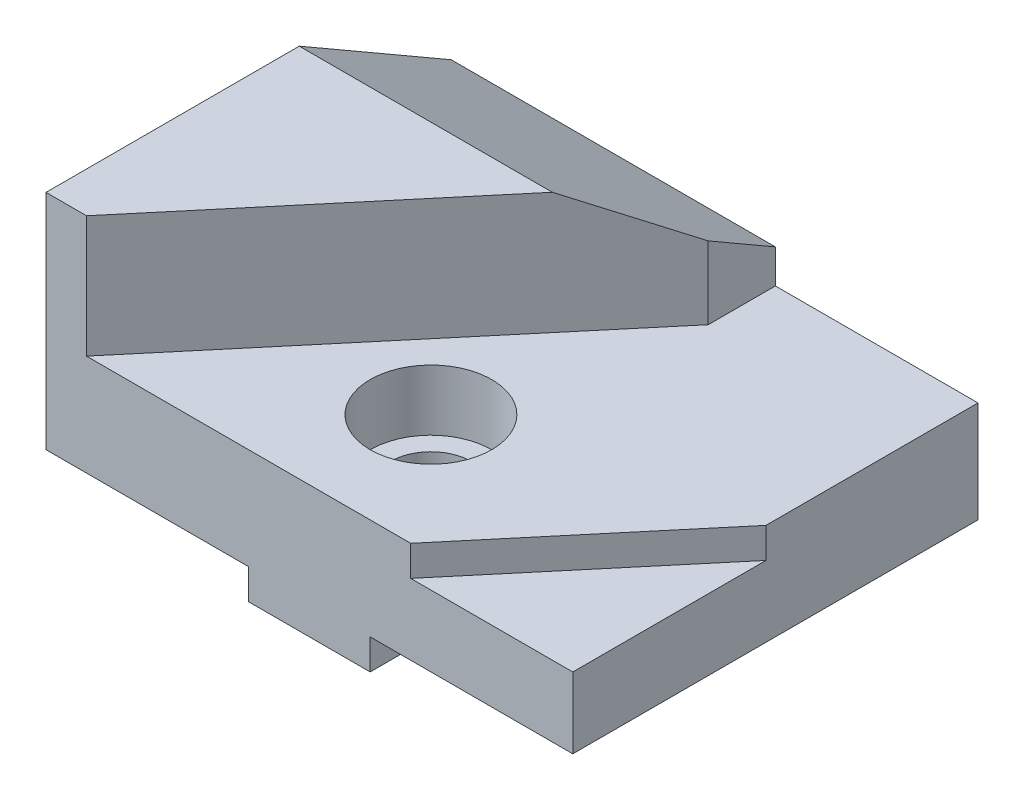
ISO-10303-21;
HEADER;
FILE_DESCRIPTION(('STEP AP214'),'2;1');
FILE_NAME('part.step','',(''),(''),'','','');
FILE_SCHEMA(('AUTOMOTIVE_DESIGN { 1 0 10303 214 1 1 1 1 }'));
ENDSEC;
DATA;
#1=APPLICATION_CONTEXT('core data for automotive mechanical design processes');
#2=APPLICATION_PROTOCOL_DEFINITION('international standard','automotive_design',2000,#1);
#3=PRODUCT_CONTEXT('',#1,'mechanical');
#4=PRODUCT('Part','Part','',(#3));
#5=PRODUCT_RELATED_PRODUCT_CATEGORY('part','',(#4));
#6=PRODUCT_DEFINITION_FORMATION('','',#4);
#7=PRODUCT_DEFINITION_CONTEXT('part definition',#1,'design');
#8=PRODUCT_DEFINITION('design','',#6,#7);
#9=PRODUCT_DEFINITION_SHAPE('','',#8);
#10=(LENGTH_UNIT() NAMED_UNIT(*) SI_UNIT(.MILLI.,.METRE.));
#11=(NAMED_UNIT(*) PLANE_ANGLE_UNIT() SI_UNIT($,.RADIAN.));
#12=(NAMED_UNIT(*) SI_UNIT($,.STERADIAN.) SOLID_ANGLE_UNIT());
#13=UNCERTAINTY_MEASURE_WITH_UNIT(LENGTH_MEASURE(1.E-05),#10,'distance_accuracy_value','');
#14=(GEOMETRIC_REPRESENTATION_CONTEXT(3) GLOBAL_UNCERTAINTY_ASSIGNED_CONTEXT((#13)) GLOBAL_UNIT_ASSIGNED_CONTEXT((#10,
#11,#12)) REPRESENTATION_CONTEXT('',''));
#15=CARTESIAN_POINT('',(0.,0.,0.));
#16=DIRECTION('',(0.,0.,1.));
#17=DIRECTION('',(1.,0.,0.));
#18=AXIS2_PLACEMENT_3D('',#15,#16,#17);
#19=CARTESIAN_POINT('',(82.55,0.,63.5));
#20=DIRECTION('',(-1.,0.,0.));
#21=DIRECTION('',(0.,0.,1.));
#22=AXIS2_PLACEMENT_3D('',#19,#20,#21);
#23=PLANE('',#22);
#24=DIRECTION('',(0.,0.,-1.));
#25=VECTOR('',#24,1.);
#26=CARTESIAN_POINT('',(82.55,15.875,63.5));
#27=LINE('',#26,#25);
#28=CARTESIAN_POINT('',(82.55,15.875,33.2294587481067));
#29=VERTEX_POINT('',#28);
#30=CARTESIAN_POINT('',(82.55,15.875,0.));
#31=VERTEX_POINT('',#30);
#32=EDGE_CURVE('E180',#29,#31,#27,.T.);
#33=ORIENTED_EDGE('',*,*,#32,.F.);
#34=DIRECTION('',(0.,1.,0.));
#35=VECTOR('',#34,1.);
#36=CARTESIAN_POINT('',(82.55,11.1125,33.2294587481067));
#37=LINE('',#36,#35);
#38=CARTESIAN_POINT('',(82.55,11.1125,33.2294587481067));
#39=VERTEX_POINT('',#38);
#40=EDGE_CURVE('E47',#39,#29,#37,.T.);
#41=ORIENTED_EDGE('',*,*,#40,.F.);
#42=DIRECTION('',(0.,0.,-1.));
#43=VECTOR('',#42,1.);
#44=CARTESIAN_POINT('',(82.55,11.1125,63.5));
#45=LINE('',#44,#43);
#46=CARTESIAN_POINT('',(82.55,11.1125,63.5));
#47=VERTEX_POINT('',#46);
#48=EDGE_CURVE('E140',#47,#39,#45,.T.);
#49=ORIENTED_EDGE('',*,*,#48,.F.);
#50=DIRECTION('',(0.,1.,0.));
#51=VECTOR('',#50,1.);
#52=CARTESIAN_POINT('',(82.55,0.,63.5));
#53=LINE('',#52,#51);
#54=CARTESIAN_POINT('',(82.55,0.,63.5));
#55=VERTEX_POINT('',#54);
#56=EDGE_CURVE('E150',#55,#47,#53,.T.);
#57=ORIENTED_EDGE('',*,*,#56,.F.);
#58=DIRECTION('',(0.,0.,-1.));
#59=VECTOR('',#58,1.);
#60=CARTESIAN_POINT('',(82.55,0.,63.5));
#61=LINE('',#60,#59);
#62=CARTESIAN_POINT('',(82.55,0.,0.));
#63=VERTEX_POINT('',#62);
#64=EDGE_CURVE('E224',#55,#63,#61,.T.);
#65=ORIENTED_EDGE('',*,*,#64,.T.);
#66=DIRECTION('',(0.,1.,0.));
#67=VECTOR('',#66,1.);
#68=CARTESIAN_POINT('',(82.55,0.,0.));
#69=LINE('',#68,#67);
#70=EDGE_CURVE('E195',#63,#31,#69,.T.);
#71=ORIENTED_EDGE('',*,*,#70,.T.);
#72=EDGE_LOOP('',(#33,#41,#49,#57,#65,#71));
#73=FACE_BOUND('',#72,.T.);
#74=ADVANCED_FACE('F32',(#73),#23,.F.);
#75=CARTESIAN_POINT('',(0.,34.925,63.5));
#76=DIRECTION('',(1.,0.,0.));
#77=DIRECTION('',(0.,0.,-1.));
#78=AXIS2_PLACEMENT_3D('',#75,#76,#77);
#79=PLANE('',#78);
#80=DIRECTION('',(0.,0.,-1.));
#81=VECTOR('',#80,1.);
#82=CARTESIAN_POINT('',(0.,34.925,63.5));
#83=LINE('',#82,#81);
#84=CARTESIAN_POINT('',(0.,34.925,63.5));
#85=VERTEX_POINT('',#84);
#86=CARTESIAN_POINT('',(0.,34.925,23.8125000000001));
#87=VERTEX_POINT('',#86);
#88=EDGE_CURVE('E208',#85,#87,#83,.T.);
#89=ORIENTED_EDGE('',*,*,#88,.T.);
#90=DIRECTION('',(0.,0.499999999999998,0.86602540378444));
#91=VECTOR('',#90,1.);
#92=CARTESIAN_POINT('',(0.,34.925,23.8125000000001));
#93=LINE('',#92,#91);
#94=CARTESIAN_POINT('',(0.,21.176846714922,0.));
#95=VERTEX_POINT('',#94);
#96=EDGE_CURVE('E244',#87,#95,#93,.F.);
#97=ORIENTED_EDGE('',*,*,#96,.T.);
#98=DIRECTION('',(0.,-1.,0.));
#99=VECTOR('',#98,1.);
#100=CARTESIAN_POINT('',(0.,34.925,0.));
#101=LINE('',#100,#99);
#102=CARTESIAN_POINT('',(0.,0.,0.));
#103=VERTEX_POINT('',#102);
#104=EDGE_CURVE('E186',#95,#103,#101,.T.);
#105=ORIENTED_EDGE('',*,*,#104,.T.);
#106=DIRECTION('',(0.,0.,-1.));
#107=VECTOR('',#106,1.);
#108=CARTESIAN_POINT('',(0.,0.,63.5));
#109=LINE('',#108,#107);
#110=CARTESIAN_POINT('',(0.,0.,63.5));
#111=VERTEX_POINT('',#110);
#112=EDGE_CURVE('E239',#111,#103,#109,.T.);
#113=ORIENTED_EDGE('',*,*,#112,.F.);
#114=DIRECTION('',(0.,-1.,0.));
#115=VECTOR('',#114,1.);
#116=CARTESIAN_POINT('',(0.,34.925,63.5));
#117=LINE('',#116,#115);
#118=EDGE_CURVE('E191',#85,#111,#117,.T.);
#119=ORIENTED_EDGE('',*,*,#118,.F.);
#120=EDGE_LOOP('',(#89,#97,#105,#113,#119));
#121=FACE_BOUND('',#120,.T.);
#122=ADVANCED_FACE('F276',(#121),#79,.F.);
#123=CARTESIAN_POINT('',(0.,0.,63.5));
#124=DIRECTION('',(0.,1.,0.));
#125=DIRECTION('',(0.,0.,1.));
#126=AXIS2_PLACEMENT_3D('',#123,#124,#125);
#127=PLANE('',#126);
#128=DIRECTION('',(1.,0.,0.));
#129=VECTOR('',#128,1.);
#130=CARTESIAN_POINT('',(0.,0.,0.));
#131=LINE('',#130,#129);
#132=CARTESIAN_POINT('',(31.75,0.,0.));
#133=VERTEX_POINT('',#132);
#134=EDGE_CURVE('E210',#103,#133,#131,.T.);
#135=ORIENTED_EDGE('',*,*,#134,.T.);
#136=DIRECTION('',(0.,0.,-1.));
#137=VECTOR('',#136,1.);
#138=CARTESIAN_POINT('',(31.75,0.,63.5));
#139=LINE('',#138,#137);
#140=CARTESIAN_POINT('',(31.75,0.,63.5));
#141=VERTEX_POINT('',#140);
#142=EDGE_CURVE('E236',#141,#133,#139,.T.);
#143=ORIENTED_EDGE('',*,*,#142,.F.);
#144=DIRECTION('',(1.,0.,0.));
#145=VECTOR('',#144,1.);
#146=CARTESIAN_POINT('',(0.,0.,63.5));
#147=LINE('',#146,#145);
#148=EDGE_CURVE('E194',#111,#141,#147,.T.);
#149=ORIENTED_EDGE('',*,*,#148,.F.);
#150=ORIENTED_EDGE('',*,*,#112,.T.);
#151=EDGE_LOOP('',(#135,#143,#149,#150));
#152=FACE_BOUND('',#151,.T.);
#153=ADVANCED_FACE('F281',(#152),#127,.F.);
#154=CARTESIAN_POINT('',(31.75,0.,63.5));
#155=DIRECTION('',(1.,0.,0.));
#156=DIRECTION('',(0.,0.,-1.));
#157=AXIS2_PLACEMENT_3D('',#154,#155,#156);
#158=PLANE('',#157);
#159=DIRECTION('',(0.,-1.,0.));
#160=VECTOR('',#159,1.);
#161=CARTESIAN_POINT('',(31.75,0.,0.));
#162=LINE('',#161,#160);
#163=CARTESIAN_POINT('',(31.75,-4.7625,0.));
#164=VERTEX_POINT('',#163);
#165=EDGE_CURVE('E212',#133,#164,#162,.T.);
#166=ORIENTED_EDGE('',*,*,#165,.T.);
#167=DIRECTION('',(0.,0.,-1.));
#168=VECTOR('',#167,1.);
#169=CARTESIAN_POINT('',(31.75,-4.7625,63.5));
#170=LINE('',#169,#168);
#171=CARTESIAN_POINT('',(31.75,-4.7625,63.5));
#172=VERTEX_POINT('',#171);
#173=EDGE_CURVE('E233',#172,#164,#170,.T.);
#174=ORIENTED_EDGE('',*,*,#173,.F.);
#175=DIRECTION('',(0.,-1.,0.));
#176=VECTOR('',#175,1.);
#177=CARTESIAN_POINT('',(31.75,0.,63.5));
#178=LINE('',#177,#176);
#179=EDGE_CURVE('E197',#141,#172,#178,.T.);
#180=ORIENTED_EDGE('',*,*,#179,.F.);
#181=ORIENTED_EDGE('',*,*,#142,.T.);
#182=EDGE_LOOP('',(#166,#174,#180,#181));
#183=FACE_BOUND('',#182,.T.);
#184=ADVANCED_FACE('F283',(#183),#158,.F.);
#185=CARTESIAN_POINT('',(31.75,-4.7625,63.5));
#186=DIRECTION('',(0.,1.,0.));
#187=DIRECTION('',(-1.,0.,0.));
#188=AXIS2_PLACEMENT_3D('',#185,#186,#187);
#189=PLANE('',#188);
#190=CARTESIAN_POINT('',(41.275,-4.76250000000001,44.45));
#191=DIRECTION('',(0.,1.,0.));
#192=DIRECTION('',(0.,0.,1.));
#193=AXIS2_PLACEMENT_3D('',#190,#191,#192);
#194=CIRCLE('',#193,6.34999999999999);
#195=CARTESIAN_POINT('',(41.275,-4.76250000000001,50.8));
#196=VERTEX_POINT('',#195);
#197=EDGE_CURVE('E165',#196,#196,#194,.T.);
#198=ORIENTED_EDGE('',*,*,#197,.T.);
#199=EDGE_LOOP('',(#198));
#200=FACE_BOUND('',#199,.T.);
#201=DIRECTION('',(1.,0.,0.));
#202=VECTOR('',#201,1.);
#203=CARTESIAN_POINT('',(31.75,-4.7625,0.));
#204=LINE('',#203,#202);
#205=CARTESIAN_POINT('',(50.8,-4.7625,0.));
#206=VERTEX_POINT('',#205);
#207=EDGE_CURVE('E214',#164,#206,#204,.T.);
#208=ORIENTED_EDGE('',*,*,#207,.T.);
#209=DIRECTION('',(0.,0.,-1.));
#210=VECTOR('',#209,1.);
#211=CARTESIAN_POINT('',(50.8,-4.7625,63.5));
#212=LINE('',#211,#210);
#213=CARTESIAN_POINT('',(50.8,-4.7625,63.5));
#214=VERTEX_POINT('',#213);
#215=EDGE_CURVE('E230',#214,#206,#212,.T.);
#216=ORIENTED_EDGE('',*,*,#215,.F.);
#217=DIRECTION('',(1.,0.,0.));
#218=VECTOR('',#217,1.);
#219=CARTESIAN_POINT('',(31.75,-4.7625,63.5));
#220=LINE('',#219,#218);
#221=EDGE_CURVE('E199',#172,#214,#220,.T.);
#222=ORIENTED_EDGE('',*,*,#221,.F.);
#223=ORIENTED_EDGE('',*,*,#173,.T.);
#224=EDGE_LOOP('',(#208,#216,#222,#223));
#225=FACE_BOUND('',#224,.T.);
#226=ADVANCED_FACE('F288',(#200,#225),#189,.F.);
#227=CARTESIAN_POINT('',(50.8,-4.7625,63.5));
#228=DIRECTION('',(-1.,0.,0.));
#229=DIRECTION('',(0.,0.,1.));
#230=AXIS2_PLACEMENT_3D('',#227,#228,#229);
#231=PLANE('',#230);
#232=DIRECTION('',(0.,1.,0.));
#233=VECTOR('',#232,1.);
#234=CARTESIAN_POINT('',(50.8,-4.7625,0.));
#235=LINE('',#234,#233);
#236=CARTESIAN_POINT('',(50.8,0.,0.));
#237=VERTEX_POINT('',#236);
#238=EDGE_CURVE('E216',#206,#237,#235,.T.);
#239=ORIENTED_EDGE('',*,*,#238,.T.);
#240=DIRECTION('',(0.,0.,-1.));
#241=VECTOR('',#240,1.);
#242=CARTESIAN_POINT('',(50.8,0.,63.5));
#243=LINE('',#242,#241);
#244=CARTESIAN_POINT('',(50.8,0.,63.5));
#245=VERTEX_POINT('',#244);
#246=EDGE_CURVE('E227',#245,#237,#243,.T.);
#247=ORIENTED_EDGE('',*,*,#246,.F.);
#248=DIRECTION('',(0.,1.,0.));
#249=VECTOR('',#248,1.);
#250=CARTESIAN_POINT('',(50.8,-4.7625,63.5));
#251=LINE('',#250,#249);
#252=EDGE_CURVE('E201',#214,#245,#251,.T.);
#253=ORIENTED_EDGE('',*,*,#252,.F.);
#254=ORIENTED_EDGE('',*,*,#215,.T.);
#255=EDGE_LOOP('',(#239,#247,#253,#254));
#256=FACE_BOUND('',#255,.T.);
#257=ADVANCED_FACE('F294',(#256),#231,.F.);
#258=CARTESIAN_POINT('',(50.8,0.,63.5));
#259=DIRECTION('',(0.,1.,0.));
#260=DIRECTION('',(0.,0.,1.));
#261=AXIS2_PLACEMENT_3D('',#258,#259,#260);
#262=PLANE('',#261);
#263=DIRECTION('',(1.,0.,0.));
#264=VECTOR('',#263,1.);
#265=CARTESIAN_POINT('',(50.8,0.,0.));
#266=LINE('',#265,#264);
#267=EDGE_CURVE('E218',#237,#63,#266,.T.);
#268=ORIENTED_EDGE('',*,*,#267,.T.);
#269=ORIENTED_EDGE('',*,*,#64,.F.);
#270=DIRECTION('',(1.,0.,0.));
#271=VECTOR('',#270,1.);
#272=CARTESIAN_POINT('',(50.8,0.,63.5));
#273=LINE('',#272,#271);
#274=EDGE_CURVE('E203',#245,#55,#273,.T.);
#275=ORIENTED_EDGE('',*,*,#274,.F.);
#276=ORIENTED_EDGE('',*,*,#246,.T.);
#277=EDGE_LOOP('',(#268,#269,#275,#276));
#278=FACE_BOUND('',#277,.T.);
#279=ADVANCED_FACE('F298',(#278),#262,.F.);
#280=CARTESIAN_POINT('',(82.55,34.925,63.5));
#281=DIRECTION('',(0.,-1.,0.));
#282=DIRECTION('',(0.,0.,-1.));
#283=AXIS2_PLACEMENT_3D('',#280,#281,#282);
#284=PLANE('',#283);
#285=DIRECTION('',(-1.,0.,0.));
#286=VECTOR('',#285,1.);
#287=CARTESIAN_POINT('',(82.55,34.925,63.5));
#288=LINE('',#287,#286);
#289=CARTESIAN_POINT('',(6.35000000000001,34.925,63.5));
#290=VERTEX_POINT('',#289);
#291=EDGE_CURVE('E206',#290,#85,#288,.T.);
#292=ORIENTED_EDGE('',*,*,#291,.F.);
#293=DIRECTION('',(-0.642787609686535,0.,0.766044443118982));
#294=VECTOR('',#293,1.);
#295=CARTESIAN_POINT('',(50.8,34.925,10.5265528091867));
#296=LINE('',#295,#294);
#297=CARTESIAN_POINT('',(39.6517666123478,34.925,23.8125000000001));
#298=VERTEX_POINT('',#297);
#299=EDGE_CURVE('E168',#298,#290,#296,.T.);
#300=ORIENTED_EDGE('',*,*,#299,.F.);
#301=DIRECTION('',(-1.,0.,0.));
#302=VECTOR('',#301,1.);
#303=CARTESIAN_POINT('',(82.55,34.925,23.8125000000001));
#304=LINE('',#303,#302);
#305=EDGE_CURVE('E242',#298,#87,#304,.T.);
#306=ORIENTED_EDGE('',*,*,#305,.T.);
#307=ORIENTED_EDGE('',*,*,#88,.F.);
#308=EDGE_LOOP('',(#292,#300,#306,#307));
#309=FACE_BOUND('',#308,.T.);
#310=ADVANCED_FACE('F261',(#309),#284,.F.);
#311=CARTESIAN_POINT('',(0.,0.,63.5));
#312=DIRECTION('',(0.,0.,1.));
#313=DIRECTION('',(1.,0.,0.));
#314=AXIS2_PLACEMENT_3D('',#311,#312,#313);
#315=PLANE('',#314);
#316=DIRECTION('',(0.,1.,0.));
#317=VECTOR('',#316,1.);
#318=CARTESIAN_POINT('',(57.15,11.1125,63.5));
#319=LINE('',#318,#317);
#320=CARTESIAN_POINT('',(57.15,11.1125,63.5));
#321=VERTEX_POINT('',#320);
#322=CARTESIAN_POINT('',(57.15,15.875,63.5));
#323=VERTEX_POINT('',#322);
#324=EDGE_CURVE('E130',#321,#323,#319,.T.);
#325=ORIENTED_EDGE('',*,*,#324,.T.);
#326=DIRECTION('',(1.,0.,0.));
#327=VECTOR('',#326,1.);
#328=CARTESIAN_POINT('',(6.35000000000001,15.875,63.5));
#329=LINE('',#328,#327);
#330=CARTESIAN_POINT('',(6.35000000000001,15.875,63.5));
#331=VERTEX_POINT('',#330);
#332=EDGE_CURVE('E178',#331,#323,#329,.T.);
#333=ORIENTED_EDGE('',*,*,#332,.F.);
#334=DIRECTION('',(0.,1.,0.));
#335=VECTOR('',#334,1.);
#336=CARTESIAN_POINT('',(6.35000000000001,15.875,63.5));
#337=LINE('',#336,#335);
#338=EDGE_CURVE('E183',#331,#290,#337,.T.);
#339=ORIENTED_EDGE('',*,*,#338,.T.);
#340=ORIENTED_EDGE('',*,*,#291,.T.);
#341=ORIENTED_EDGE('',*,*,#118,.T.);
#342=ORIENTED_EDGE('',*,*,#148,.T.);
#343=ORIENTED_EDGE('',*,*,#179,.T.);
#344=ORIENTED_EDGE('',*,*,#221,.T.);
#345=ORIENTED_EDGE('',*,*,#252,.T.);
#346=ORIENTED_EDGE('',*,*,#274,.T.);
#347=ORIENTED_EDGE('',*,*,#56,.T.);
#348=DIRECTION('',(1.,0.,0.));
#349=VECTOR('',#348,1.);
#350=CARTESIAN_POINT('',(57.15,11.1125,63.5));
#351=LINE('',#350,#349);
#352=EDGE_CURVE('E144',#321,#47,#351,.T.);
#353=ORIENTED_EDGE('',*,*,#352,.F.);
#354=EDGE_LOOP('',(#325,#333,#339,#340,#341,#342,#343,#344,#345,#346,#347,#353));
#355=FACE_BOUND('',#354,.T.);
#356=ADVANCED_FACE('F148',(#355),#315,.T.);
#357=CARTESIAN_POINT('',(0.,0.,0.));
#358=DIRECTION('',(0.,0.,1.));
#359=DIRECTION('',(1.,0.,0.));
#360=AXIS2_PLACEMENT_3D('',#357,#358,#359);
#361=PLANE('',#360);
#362=DIRECTION('',(1.,0.,0.));
#363=VECTOR('',#362,1.);
#364=CARTESIAN_POINT('',(0.,21.176846714922,0.));
#365=LINE('',#364,#363);
#366=CARTESIAN_POINT('',(50.8,21.176846714922,0.));
#367=VERTEX_POINT('',#366);
#368=EDGE_CURVE('E246',#95,#367,#365,.T.);
#369=ORIENTED_EDGE('',*,*,#368,.T.);
#370=DIRECTION('',(0.,1.,0.));
#371=VECTOR('',#370,1.);
#372=CARTESIAN_POINT('',(50.8,15.875,0.));
#373=LINE('',#372,#371);
#374=CARTESIAN_POINT('',(50.8,15.875,0.));
#375=VERTEX_POINT('',#374);
#376=EDGE_CURVE('E55',#375,#367,#373,.T.);
#377=ORIENTED_EDGE('',*,*,#376,.F.);
#378=DIRECTION('',(-1.,0.,0.));
#379=VECTOR('',#378,1.);
#380=CARTESIAN_POINT('',(82.55,15.875,0.));
#381=LINE('',#380,#379);
#382=EDGE_CURVE('E169',#31,#375,#381,.T.);
#383=ORIENTED_EDGE('',*,*,#382,.F.);
#384=ORIENTED_EDGE('',*,*,#70,.F.);
#385=ORIENTED_EDGE('',*,*,#267,.F.);
#386=ORIENTED_EDGE('',*,*,#238,.F.);
#387=ORIENTED_EDGE('',*,*,#207,.F.);
#388=ORIENTED_EDGE('',*,*,#165,.F.);
#389=ORIENTED_EDGE('',*,*,#134,.F.);
#390=ORIENTED_EDGE('',*,*,#104,.F.);
#391=EDGE_LOOP('',(#369,#377,#383,#384,#385,#386,#387,#388,#389,#390));
#392=FACE_BOUND('',#391,.T.);
#393=ADVANCED_FACE('F270',(#392),#361,.F.);
#394=CARTESIAN_POINT('',(82.55,34.925,23.8125000000001));
#395=DIRECTION('',(0.,-0.86602540378444,0.499999999999998));
#396=DIRECTION('',(-1.,0.,0.));
#397=AXIS2_PLACEMENT_3D('',#394,#395,#396);
#398=PLANE('',#397);
#399=DIRECTION('',(0.587858883152551,-0.404481746652006,-0.700582935935481));
#400=VECTOR('',#399,1.);
#401=CARTESIAN_POINT('',(54.4764551627769,24.7247358034419,6.14512416093576));
#402=LINE('',#401,#400);
#403=CARTESIAN_POINT('',(50.8,27.2543548129448,10.5265528091867));
#404=VERTEX_POINT('',#403);
#405=EDGE_CURVE('E11',#404,#298,#402,.F.);
#406=ORIENTED_EDGE('',*,*,#405,.F.);
#407=DIRECTION('',(0.,-0.499999999999998,-0.86602540378444));
#408=VECTOR('',#407,1.);
#409=CARTESIAN_POINT('',(50.8,34.925,23.8125000000001));
#410=LINE('',#409,#408);
#411=EDGE_CURVE('E40',#367,#404,#410,.F.);
#412=ORIENTED_EDGE('',*,*,#411,.F.);
#413=ORIENTED_EDGE('',*,*,#368,.F.);
#414=ORIENTED_EDGE('',*,*,#96,.F.);
#415=ORIENTED_EDGE('',*,*,#305,.F.);
#416=EDGE_LOOP('',(#406,#412,#413,#414,#415));
#417=FACE_BOUND('',#416,.T.);
#418=ADVANCED_FACE('F34',(#417),#398,.F.);
#419=CARTESIAN_POINT('',(50.8,15.875,10.5265528091867));
#420=DIRECTION('',(-0.766044443118982,0.,-0.642787609686535));
#421=DIRECTION('',(-0.642787609686535,0.,0.766044443118982));
#422=AXIS2_PLACEMENT_3D('',#419,#420,#421);
#423=PLANE('',#422);
#424=ORIENTED_EDGE('',*,*,#405,.T.);
#425=ORIENTED_EDGE('',*,*,#299,.T.);
#426=ORIENTED_EDGE('',*,*,#338,.F.);
#427=DIRECTION('',(-0.642787609686535,0.,0.766044443118982));
#428=VECTOR('',#427,1.);
#429=CARTESIAN_POINT('',(50.8,15.875,10.5265528091867));
#430=LINE('',#429,#428);
#431=CARTESIAN_POINT('',(50.8,15.875,10.5265528091867));
#432=VERTEX_POINT('',#431);
#433=EDGE_CURVE('E175',#432,#331,#430,.T.);
#434=ORIENTED_EDGE('',*,*,#433,.F.);
#435=DIRECTION('',(0.,1.,0.));
#436=VECTOR('',#435,1.);
#437=CARTESIAN_POINT('',(50.8,15.875,10.5265528091867));
#438=LINE('',#437,#436);
#439=EDGE_CURVE('E187',#432,#404,#438,.T.);
#440=ORIENTED_EDGE('',*,*,#439,.T.);
#441=EDGE_LOOP('',(#424,#425,#426,#434,#440));
#442=FACE_BOUND('',#441,.T.);
#443=ADVANCED_FACE('F254',(#442),#423,.F.);
#444=CARTESIAN_POINT('',(50.8,15.875,0.));
#445=DIRECTION('',(-1.,0.,0.));
#446=DIRECTION('',(0.,-1.,0.));
#447=AXIS2_PLACEMENT_3D('',#444,#445,#446);
#448=PLANE('',#447);
#449=ORIENTED_EDGE('',*,*,#411,.T.);
#450=ORIENTED_EDGE('',*,*,#439,.F.);
#451=DIRECTION('',(0.,0.,1.));
#452=VECTOR('',#451,1.);
#453=CARTESIAN_POINT('',(50.8,15.875,0.));
#454=LINE('',#453,#452);
#455=EDGE_CURVE('E172',#375,#432,#454,.T.);
#456=ORIENTED_EDGE('',*,*,#455,.F.);
#457=ORIENTED_EDGE('',*,*,#376,.T.);
#458=EDGE_LOOP('',(#449,#450,#456,#457));
#459=FACE_BOUND('',#458,.T.);
#460=ADVANCED_FACE('F248',(#459),#448,.F.);
#461=CARTESIAN_POINT('',(0.,15.875,0.));
#462=DIRECTION('',(0.,1.,0.));
#463=DIRECTION('',(-1.,0.,0.));
#464=AXIS2_PLACEMENT_3D('',#461,#462,#463);
#465=PLANE('',#464);
#466=DIRECTION('',(-0.642787609686535,0.,0.766044443118982));
#467=VECTOR('',#466,1.);
#468=CARTESIAN_POINT('',(82.55,15.875,33.2294587481067));
#469=LINE('',#468,#467);
#470=EDGE_CURVE('E135',#29,#323,#469,.T.);
#471=ORIENTED_EDGE('',*,*,#470,.F.);
#472=ORIENTED_EDGE('',*,*,#32,.T.);
#473=ORIENTED_EDGE('',*,*,#382,.T.);
#474=ORIENTED_EDGE('',*,*,#455,.T.);
#475=ORIENTED_EDGE('',*,*,#433,.T.);
#476=ORIENTED_EDGE('',*,*,#332,.T.);
#477=EDGE_LOOP('',(#471,#472,#473,#474,#475,#476));
#478=FACE_BOUND('',#477,.T.);
#479=CARTESIAN_POINT('',(41.275,15.875,44.45));
#480=DIRECTION('',(0.,1.,0.));
#481=DIRECTION('',(0.,0.,1.));
#482=AXIS2_PLACEMENT_3D('',#479,#480,#481);
#483=CIRCLE('',#482,9.525);
#484=CARTESIAN_POINT('',(41.275,15.875,53.975));
#485=VERTEX_POINT('',#484);
#486=EDGE_CURVE('E155',#485,#485,#483,.T.);
#487=ORIENTED_EDGE('',*,*,#486,.F.);
#488=EDGE_LOOP('',(#487));
#489=FACE_BOUND('',#488,.T.);
#490=ADVANCED_FACE('F264',(#478,#489),#465,.T.);
#491=CARTESIAN_POINT('',(41.275,15.875,44.45));
#492=DIRECTION('',(0.,1.,0.));
#493=DIRECTION('',(0.,0.,1.));
#494=AXIS2_PLACEMENT_3D('',#491,#492,#493);
#495=CYLINDRICAL_SURFACE('',#494,6.35);
#496=ORIENTED_EDGE('',*,*,#197,.F.);
#497=EDGE_LOOP('',(#496));
#498=FACE_BOUND('',#497,.T.);
#499=CARTESIAN_POINT('',(41.275,6.35,44.45));
#500=DIRECTION('',(0.,1.,0.));
#501=DIRECTION('',(0.,0.,1.));
#502=AXIS2_PLACEMENT_3D('',#499,#500,#501);
#503=CIRCLE('',#502,6.35);
#504=CARTESIAN_POINT('',(41.275,6.35,50.8));
#505=VERTEX_POINT('',#504);
#506=EDGE_CURVE('E162',#505,#505,#503,.T.);
#507=ORIENTED_EDGE('',*,*,#506,.T.);
#508=EDGE_LOOP('',(#507));
#509=FACE_BOUND('',#508,.T.);
#510=ADVANCED_FACE('F378',(#498,#509),#495,.F.);
#511=CARTESIAN_POINT('',(47.625,6.35,44.45));
#512=DIRECTION('',(0.,-1.,0.));
#513=DIRECTION('',(0.,0.,-1.));
#514=AXIS2_PLACEMENT_3D('',#511,#512,#513);
#515=PLANE('',#514);
#516=ORIENTED_EDGE('',*,*,#506,.F.);
#517=EDGE_LOOP('',(#516));
#518=FACE_BOUND('',#517,.T.);
#519=CARTESIAN_POINT('',(41.275,6.35,44.45));
#520=DIRECTION('',(0.,1.,0.));
#521=DIRECTION('',(0.,0.,1.));
#522=AXIS2_PLACEMENT_3D('',#519,#520,#521);
#523=CIRCLE('',#522,9.525);
#524=CARTESIAN_POINT('',(41.275,6.35,53.975));
#525=VERTEX_POINT('',#524);
#526=EDGE_CURVE('E159',#525,#525,#523,.T.);
#527=ORIENTED_EDGE('',*,*,#526,.T.);
#528=EDGE_LOOP('',(#527));
#529=FACE_BOUND('',#528,.T.);
#530=ADVANCED_FACE('F385',(#518,#529),#515,.F.);
#531=CARTESIAN_POINT('',(41.275,15.875,44.45));
#532=DIRECTION('',(0.,1.,0.));
#533=DIRECTION('',(0.,0.,1.));
#534=AXIS2_PLACEMENT_3D('',#531,#532,#533);
#535=CYLINDRICAL_SURFACE('',#534,9.525);
#536=ORIENTED_EDGE('',*,*,#526,.F.);
#537=EDGE_LOOP('',(#536));
#538=FACE_BOUND('',#537,.T.);
#539=ORIENTED_EDGE('',*,*,#486,.T.);
#540=EDGE_LOOP('',(#539));
#541=FACE_BOUND('',#540,.T.);
#542=ADVANCED_FACE('F393',(#538,#541),#535,.F.);
#543=CARTESIAN_POINT('',(82.55,11.1125,33.2294587481067));
#544=DIRECTION('',(-0.766044443118982,0.,-0.642787609686535));
#545=DIRECTION('',(-0.642787609686535,0.,0.766044443118982));
#546=AXIS2_PLACEMENT_3D('',#543,#544,#545);
#547=PLANE('',#546);
#548=ORIENTED_EDGE('',*,*,#470,.T.);
#549=ORIENTED_EDGE('',*,*,#324,.F.);
#550=DIRECTION('',(-0.642787609686535,0.,0.766044443118982));
#551=VECTOR('',#550,1.);
#552=CARTESIAN_POINT('',(82.55,11.1125,33.2294587481067));
#553=LINE('',#552,#551);
#554=EDGE_CURVE('E133',#39,#321,#553,.T.);
#555=ORIENTED_EDGE('',*,*,#554,.F.);
#556=ORIENTED_EDGE('',*,*,#40,.T.);
#557=EDGE_LOOP('',(#548,#549,#555,#556));
#558=FACE_BOUND('',#557,.T.);
#559=ADVANCED_FACE('F132',(#558),#547,.F.);
#560=CARTESIAN_POINT('',(0.,11.1125,0.));
#561=DIRECTION('',(0.,1.,0.));
#562=DIRECTION('',(-1.,0.,0.));
#563=AXIS2_PLACEMENT_3D('',#560,#561,#562);
#564=PLANE('',#563);
#565=ORIENTED_EDGE('',*,*,#554,.T.);
#566=ORIENTED_EDGE('',*,*,#352,.T.);
#567=ORIENTED_EDGE('',*,*,#48,.T.);
#568=EDGE_LOOP('',(#565,#566,#567));
#569=FACE_BOUND('',#568,.T.);
#570=ADVANCED_FACE('F143',(#569),#564,.T.);
#571=CLOSED_SHELL('',(#74,#122,#153,#184,#226,#257,#279,#310,#356,#393,#418,#443,#460,#490,#510,
#530,#542,#559,#570));
#572=MANIFOLD_SOLID_BREP('B2',#571);
#573=ADVANCED_BREP_SHAPE_REPRESENTATION('',(#18,#572),#14);
#574=SHAPE_DEFINITION_REPRESENTATION(#9,#573);
ENDSEC;
END-ISO-10303-21;
